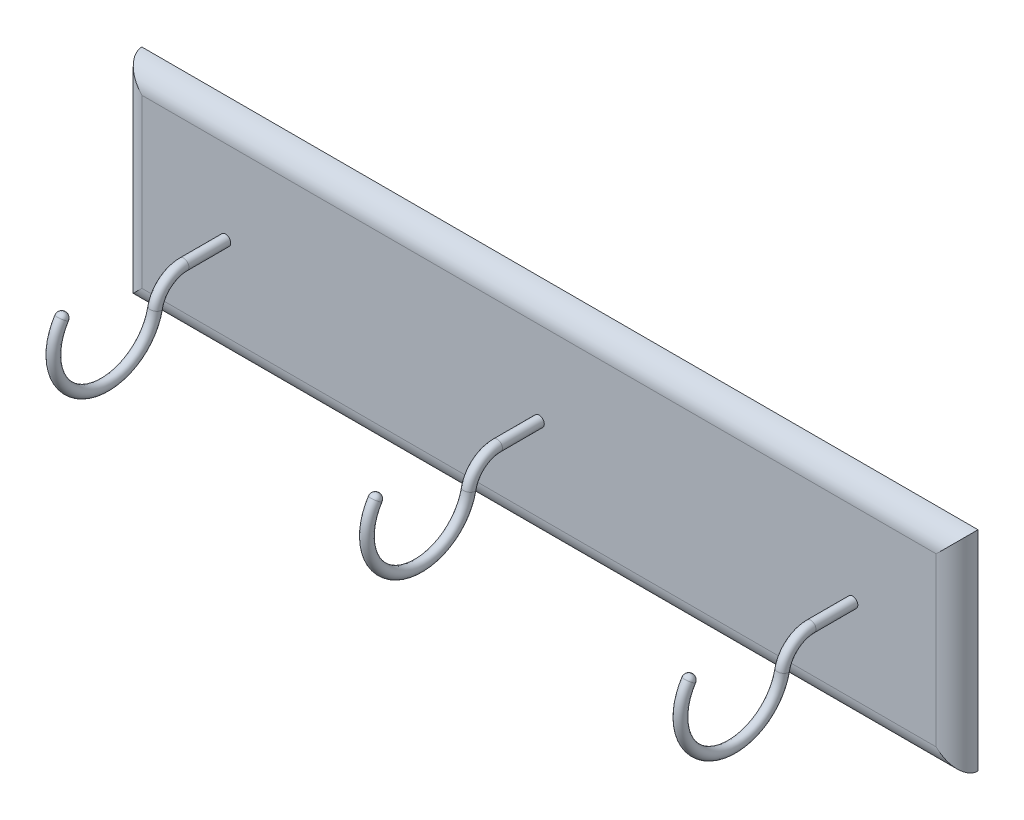
ISO-10303-21;
HEADER;
FILE_DESCRIPTION(('STEP AP214'),'2;1');
FILE_NAME('part.step','',(''),(''),'','','');
FILE_SCHEMA(('AUTOMOTIVE_DESIGN { 1 0 10303 214 1 1 1 1 }'));
ENDSEC;
DATA;
#1=APPLICATION_CONTEXT('core data for automotive mechanical design processes');
#2=APPLICATION_PROTOCOL_DEFINITION('international standard','automotive_design',2000,#1);
#3=PRODUCT_CONTEXT('',#1,'mechanical');
#4=PRODUCT('Part','Part','',(#3));
#5=PRODUCT_RELATED_PRODUCT_CATEGORY('part','',(#4));
#6=PRODUCT_DEFINITION_FORMATION('','',#4);
#7=PRODUCT_DEFINITION_CONTEXT('part definition',#1,'design');
#8=PRODUCT_DEFINITION('design','',#6,#7);
#9=PRODUCT_DEFINITION_SHAPE('','',#8);
#10=(LENGTH_UNIT() NAMED_UNIT(*) SI_UNIT(.MILLI.,.METRE.));
#11=(NAMED_UNIT(*) PLANE_ANGLE_UNIT() SI_UNIT($,.RADIAN.));
#12=(NAMED_UNIT(*) SI_UNIT($,.STERADIAN.) SOLID_ANGLE_UNIT());
#13=UNCERTAINTY_MEASURE_WITH_UNIT(LENGTH_MEASURE(1.E-05),#10,'distance_accuracy_value','');
#14=(GEOMETRIC_REPRESENTATION_CONTEXT(3) GLOBAL_UNCERTAINTY_ASSIGNED_CONTEXT((#13)) GLOBAL_UNIT_ASSIGNED_CONTEXT((#10,
#11,#12)) REPRESENTATION_CONTEXT('',''));
#15=CARTESIAN_POINT('',(0.,0.,0.));
#16=DIRECTION('',(0.,0.,1.));
#17=DIRECTION('',(1.,0.,0.));
#18=AXIS2_PLACEMENT_3D('',#15,#16,#17);
#19=CARTESIAN_POINT('',(0.,0.,10.));
#20=DIRECTION('',(0.,0.,-1.));
#21=DIRECTION('',(-1.,0.,0.));
#22=AXIS2_PLACEMENT_3D('',#19,#20,#21);
#23=PLANE('',#22);
#24=CARTESIAN_POINT('',(150.,0.,10.));
#25=DIRECTION('',(0.,0.,-1.));
#26=DIRECTION('',(-1.,0.,0.));
#27=AXIS2_PLACEMENT_3D('',#24,#25,#26);
#28=CIRCLE('',#27,2.5);
#29=CARTESIAN_POINT('',(147.5,0.,10.));
#30=VERTEX_POINT('',#29);
#31=EDGE_CURVE('E42',#30,#30,#28,.F.);
#32=ORIENTED_EDGE('',*,*,#31,.F.);
#33=EDGE_LOOP('',(#32));
#34=FACE_BOUND('',#33,.T.);
#35=DIRECTION('',(0.,-1.,0.));
#36=VECTOR('',#35,1.);
#37=CARTESIAN_POINT('',(-190.,0.,10.));
#38=LINE('',#37,#36);
#39=CARTESIAN_POINT('',(-190.,40.,10.));
#40=VERTEX_POINT('',#39);
#41=CARTESIAN_POINT('',(-190.,-40.,10.));
#42=VERTEX_POINT('',#41);
#43=EDGE_CURVE('E49',#40,#42,#38,.T.);
#44=ORIENTED_EDGE('',*,*,#43,.T.);
#45=DIRECTION('',(1.,0.,0.));
#46=VECTOR('',#45,1.);
#47=CARTESIAN_POINT('',(0.,-40.,10.));
#48=LINE('',#47,#46);
#49=CARTESIAN_POINT('',(190.,-40.,10.));
#50=VERTEX_POINT('',#49);
#51=EDGE_CURVE('E110',#42,#50,#48,.T.);
#52=ORIENTED_EDGE('',*,*,#51,.T.);
#53=DIRECTION('',(0.,1.,0.));
#54=VECTOR('',#53,1.);
#55=CARTESIAN_POINT('',(190.,0.,10.));
#56=LINE('',#55,#54);
#57=CARTESIAN_POINT('',(190.,40.,10.));
#58=VERTEX_POINT('',#57);
#59=EDGE_CURVE('E106',#50,#58,#56,.T.);
#60=ORIENTED_EDGE('',*,*,#59,.T.);
#61=DIRECTION('',(-1.,0.,0.));
#62=VECTOR('',#61,1.);
#63=CARTESIAN_POINT('',(0.,40.,10.));
#64=LINE('',#63,#62);
#65=EDGE_CURVE('E54',#58,#40,#64,.T.);
#66=ORIENTED_EDGE('',*,*,#65,.T.);
#67=EDGE_LOOP('',(#44,#52,#60,#66));
#68=FACE_BOUND('',#67,.T.);
#69=CARTESIAN_POINT('',(0.,0.,10.));
#70=DIRECTION('',(0.,0.,1.));
#71=DIRECTION('',(1.,0.,0.));
#72=AXIS2_PLACEMENT_3D('',#69,#70,#71);
#73=CIRCLE('',#72,2.5);
#74=CARTESIAN_POINT('',(2.5,0.,10.));
#75=VERTEX_POINT('',#74);
#76=EDGE_CURVE('E112',#75,#75,#73,.T.);
#77=ORIENTED_EDGE('',*,*,#76,.F.);
#78=EDGE_LOOP('',(#77));
#79=FACE_BOUND('',#78,.T.);
#80=CARTESIAN_POINT('',(-150.,0.,10.));
#81=DIRECTION('',(0.,0.,-1.));
#82=DIRECTION('',(-1.,0.,0.));
#83=AXIS2_PLACEMENT_3D('',#80,#81,#82);
#84=CIRCLE('',#83,2.5);
#85=CARTESIAN_POINT('',(-152.5,0.,10.));
#86=VERTEX_POINT('',#85);
#87=EDGE_CURVE('E11',#86,#86,#84,.F.);
#88=ORIENTED_EDGE('',*,*,#87,.F.);
#89=EDGE_LOOP('',(#88));
#90=FACE_BOUND('',#89,.T.);
#91=ADVANCED_FACE('F33',(#34,#68,#79,#90),#23,.F.);
#92=CARTESIAN_POINT('',(0.,0.,0.));
#93=DIRECTION('',(0.,0.,-1.));
#94=DIRECTION('',(-1.,0.,0.));
#95=AXIS2_PLACEMENT_3D('',#92,#93,#94);
#96=PLANE('',#95);
#97=DIRECTION('',(0.,1.,0.));
#98=VECTOR('',#97,1.);
#99=CARTESIAN_POINT('',(200.,-50.,0.));
#100=LINE('',#99,#98);
#101=CARTESIAN_POINT('',(200.,-50.,0.));
#102=VERTEX_POINT('',#101);
#103=CARTESIAN_POINT('',(200.,50.,0.));
#104=VERTEX_POINT('',#103);
#105=EDGE_CURVE('E79',#102,#104,#100,.T.);
#106=ORIENTED_EDGE('',*,*,#105,.F.);
#107=DIRECTION('',(1.,0.,0.));
#108=VECTOR('',#107,1.);
#109=CARTESIAN_POINT('',(-200.,-50.,0.));
#110=LINE('',#109,#108);
#111=CARTESIAN_POINT('',(-200.,-50.,0.));
#112=VERTEX_POINT('',#111);
#113=EDGE_CURVE('E104',#112,#102,#110,.T.);
#114=ORIENTED_EDGE('',*,*,#113,.F.);
#115=DIRECTION('',(0.,-1.,0.));
#116=VECTOR('',#115,1.);
#117=CARTESIAN_POINT('',(-200.,-50.,0.));
#118=LINE('',#117,#116);
#119=CARTESIAN_POINT('',(-200.,50.,0.));
#120=VERTEX_POINT('',#119);
#121=EDGE_CURVE('E82',#120,#112,#118,.T.);
#122=ORIENTED_EDGE('',*,*,#121,.F.);
#123=DIRECTION('',(-1.,0.,0.));
#124=VECTOR('',#123,1.);
#125=CARTESIAN_POINT('',(-200.,50.,0.));
#126=LINE('',#125,#124);
#127=EDGE_CURVE('E74',#104,#120,#126,.T.);
#128=ORIENTED_EDGE('',*,*,#127,.F.);
#129=EDGE_LOOP('',(#106,#114,#122,#128));
#130=FACE_BOUND('',#129,.T.);
#131=ADVANCED_FACE('F76',(#130),#96,.T.);
#132=CARTESIAN_POINT('',(0.,40.,0.));
#133=DIRECTION('',(-1.,0.,0.));
#134=DIRECTION('',(0.,0.,1.));
#135=AXIS2_PLACEMENT_3D('',#132,#133,#134);
#136=CYLINDRICAL_SURFACE('',#135,10.);
#137=CARTESIAN_POINT('',(190.,40.,0.));
#138=DIRECTION('',(-0.707106781186547,0.707106781186547,0.));
#139=DIRECTION('',(0.707106781186547,0.707106781186547,0.));
#140=AXIS2_PLACEMENT_3D('',#137,#138,#139);
#141=ELLIPSE('',#140,14.1421356237309,10.);
#142=EDGE_CURVE('E87',#104,#58,#141,.F.);
#143=ORIENTED_EDGE('',*,*,#142,.F.);
#144=ORIENTED_EDGE('',*,*,#127,.T.);
#145=CARTESIAN_POINT('',(-190.,40.,0.));
#146=DIRECTION('',(-0.707106781186547,-0.707106781186547,0.));
#147=DIRECTION('',(-0.707106781186547,0.707106781186547,0.));
#148=AXIS2_PLACEMENT_3D('',#145,#146,#147);
#149=ELLIPSE('',#148,14.1421356237309,10.);
#150=EDGE_CURVE('E91',#40,#120,#149,.T.);
#151=ORIENTED_EDGE('',*,*,#150,.F.);
#152=ORIENTED_EDGE('',*,*,#65,.F.);
#153=EDGE_LOOP('',(#143,#144,#151,#152));
#154=FACE_BOUND('',#153,.T.);
#155=ADVANCED_FACE('F88',(#154),#136,.T.);
#156=CARTESIAN_POINT('',(-190.,0.,0.));
#157=DIRECTION('',(0.,-1.,0.));
#158=DIRECTION('',(0.,0.,-1.));
#159=AXIS2_PLACEMENT_3D('',#156,#157,#158);
#160=CYLINDRICAL_SURFACE('',#159,10.);
#161=ORIENTED_EDGE('',*,*,#150,.T.);
#162=ORIENTED_EDGE('',*,*,#121,.T.);
#163=CARTESIAN_POINT('',(-190.,-40.,0.));
#164=DIRECTION('',(0.707106781186547,-0.707106781186547,0.));
#165=DIRECTION('',(-0.707106781186547,-0.707106781186547,0.));
#166=AXIS2_PLACEMENT_3D('',#163,#164,#165);
#167=ELLIPSE('',#166,14.1421356237309,10.);
#168=EDGE_CURVE('E92',#42,#112,#167,.T.);
#169=ORIENTED_EDGE('',*,*,#168,.F.);
#170=ORIENTED_EDGE('',*,*,#43,.F.);
#171=EDGE_LOOP('',(#161,#162,#169,#170));
#172=FACE_BOUND('',#171,.T.);
#173=ADVANCED_FACE('F197',(#172),#160,.T.);
#174=CARTESIAN_POINT('',(190.,0.,0.));
#175=DIRECTION('',(0.,1.,0.));
#176=DIRECTION('',(0.,0.,1.));
#177=AXIS2_PLACEMENT_3D('',#174,#175,#176);
#178=CYLINDRICAL_SURFACE('',#177,10.);
#179=ORIENTED_EDGE('',*,*,#142,.T.);
#180=ORIENTED_EDGE('',*,*,#59,.F.);
#181=CARTESIAN_POINT('',(190.,-40.,0.));
#182=DIRECTION('',(0.707106781186547,0.707106781186547,0.));
#183=DIRECTION('',(-0.707106781186547,0.707106781186547,0.));
#184=AXIS2_PLACEMENT_3D('',#181,#182,#183);
#185=ELLIPSE('',#184,14.1421356237309,10.);
#186=EDGE_CURVE('E96',#102,#50,#185,.F.);
#187=ORIENTED_EDGE('',*,*,#186,.F.);
#188=ORIENTED_EDGE('',*,*,#105,.T.);
#189=EDGE_LOOP('',(#179,#180,#187,#188));
#190=FACE_BOUND('',#189,.T.);
#191=ADVANCED_FACE('F95',(#190),#178,.T.);
#192=CARTESIAN_POINT('',(0.,-40.,0.));
#193=DIRECTION('',(1.,0.,0.));
#194=DIRECTION('',(0.,0.,-1.));
#195=AXIS2_PLACEMENT_3D('',#192,#193,#194);
#196=CYLINDRICAL_SURFACE('',#195,10.);
#197=ORIENTED_EDGE('',*,*,#168,.T.);
#198=ORIENTED_EDGE('',*,*,#113,.T.);
#199=ORIENTED_EDGE('',*,*,#186,.T.);
#200=ORIENTED_EDGE('',*,*,#51,.F.);
#201=EDGE_LOOP('',(#197,#198,#199,#200));
#202=FACE_BOUND('',#201,.T.);
#203=ADVANCED_FACE('F187',(#202),#196,.T.);
#204=CARTESIAN_POINT('',(0.,-6.46562704163875,67.7783170787396));
#205=DIRECTION('',(-1.,0.,0.));
#206=DIRECTION('',(0.,0.,1.));
#207=AXIS2_PLACEMENT_3D('',#204,#205,#206);
#208=TOROIDAL_SURFACE('',#207,24.5773446042007,2.5);
#209=CARTESIAN_POINT('',(0.,-11.2306188257926,43.6673087818936));
#210=DIRECTION('',(0.,-0.981025765196988,0.193877404613493));
#211=DIRECTION('',(1.,0.,0.));
#212=AXIS2_PLACEMENT_3D('',#209,#210,#211);
#213=CIRCLE('',#212,2.5);
#214=CARTESIAN_POINT('',(0.,-11.7153123373263,41.2147443689012));
#215=VERTEX_POINT('',#214);
#216=EDGE_CURVE('E100',#215,#215,#213,.T.);
#217=CARTESIAN_POINT('',(0.,6.9491805979503,88.3717335943753));
#218=DIRECTION('',(0.,0.837902419780365,-0.545820057277312));
#219=DIRECTION('',(1.,0.,0.));
#220=AXIS2_PLACEMENT_3D('',#217,#218,#219);
#221=CIRCLE('',#220,2.5);
#222=CARTESIAN_POINT('',(0.,8.31373074114357,90.4664896438262));
#223=VERTEX_POINT('',#222);
#224=EDGE_CURVE('E114',#223,#223,#221,.T.);
#225=CARTESIAN_POINT('',(0.,-6.46562704163875,67.7783170787396));
#226=DIRECTION('',(-1.,0.,0.));
#227=DIRECTION('',(0.,0.,1.));
#228=AXIS2_PLACEMENT_3D('',#225,#226,#227);
#229=CIRCLE('',#228,27.0773446042007);
#230=EDGE_CURVE('',#215,#223,#229,.T.);
#231=ORIENTED_EDGE('',*,*,#216,.T.);
#232=ORIENTED_EDGE('',*,*,#224,.F.);
#233=ORIENTED_EDGE('',*,*,#230,.T.);
#234=ORIENTED_EDGE('',*,*,#230,.F.);
#235=EDGE_LOOP('',(#231,#233,#232,#234));
#236=FACE_BOUND('',#235,.T.);
#237=ADVANCED_FACE('F184',(#236),#208,.T.);
#238=CARTESIAN_POINT('',(0.,-13.9316512030133,30.));
#239=DIRECTION('',(1.,0.,0.));
#240=DIRECTION('',(0.,0.,-1.));
#241=AXIS2_PLACEMENT_3D('',#238,#239,#240);
#242=TOROIDAL_SURFACE('',#241,13.9316512030133,2.5);
#243=CARTESIAN_POINT('',(0.,0.,30.));
#244=DIRECTION('',(0.,0.,1.));
#245=DIRECTION('',(1.,0.,0.));
#246=AXIS2_PLACEMENT_3D('',#243,#244,#245);
#247=CIRCLE('',#246,2.5);
#248=CARTESIAN_POINT('',(2.5,0.,30.));
#249=VERTEX_POINT('',#248);
#250=EDGE_CURVE('E122',#249,#249,#247,.T.);
#251=ORIENTED_EDGE('',*,*,#250,.T.);
#252=EDGE_LOOP('',(#251));
#253=FACE_BOUND('',#252,.T.);
#254=ORIENTED_EDGE('',*,*,#216,.F.);
#255=EDGE_LOOP('',(#254));
#256=FACE_BOUND('',#255,.T.);
#257=ADVANCED_FACE('F180',(#253,#256),#242,.T.);
#258=CARTESIAN_POINT('',(0.,0.,30.));
#259=DIRECTION('',(0.,0.,-1.));
#260=DIRECTION('',(0.,1.,0.));
#261=AXIS2_PLACEMENT_3D('',#258,#259,#260);
#262=CYLINDRICAL_SURFACE('',#261,2.5);
#263=ORIENTED_EDGE('',*,*,#250,.F.);
#264=EDGE_LOOP('',(#263));
#265=FACE_BOUND('',#264,.T.);
#266=ORIENTED_EDGE('',*,*,#76,.T.);
#267=EDGE_LOOP('',(#266));
#268=FACE_BOUND('',#267,.T.);
#269=ADVANCED_FACE('F139',(#265,#268),#262,.T.);
#270=CARTESIAN_POINT('',(0.,6.9491805979503,88.3717335943753));
#271=DIRECTION('',(0.,0.,1.));
#272=DIRECTION('',(1.,0.,0.));
#273=AXIS2_PLACEMENT_3D('',#270,#271,#272);
#274=SPHERICAL_SURFACE('',#273,2.5);
#275=CARTESIAN_POINT('',(0.,6.9491805979503,88.3717335943753));
#276=DIRECTION('',(0.,0.837902419780365,-0.545820057277312));
#277=DIRECTION('',(1.,0.,0.));
#278=AXIS2_PLACEMENT_3D('',#275,#276,#277);
#279=SPHERICAL_SURFACE('',#278,2.5);
#280=ORIENTED_EDGE('',*,*,#224,.T.);
#281=EDGE_LOOP('',(#280));
#282=FACE_BOUND('',#281,.T.);
#283=ADVANCED_FACE('F177',(#282),#279,.T.);
#284=CARTESIAN_POINT('',(150.,-6.46562704163875,67.7783170787396));
#285=DIRECTION('',(-1.,0.,0.));
#286=DIRECTION('',(0.,0.,1.));
#287=AXIS2_PLACEMENT_3D('',#284,#285,#286);
#288=TOROIDAL_SURFACE('',#287,24.5773446042007,2.5);
#289=CARTESIAN_POINT('',(150.,-11.2306188257926,43.6673087818936));
#290=DIRECTION('',(0.,-0.981025765196988,0.193877404613493));
#291=DIRECTION('',(1.,0.,0.));
#292=AXIS2_PLACEMENT_3D('',#289,#290,#291);
#293=CIRCLE('',#292,2.5);
#294=CARTESIAN_POINT('',(150.,-11.7153123373263,41.2147443689012));
#295=VERTEX_POINT('',#294);
#296=EDGE_CURVE('E123',#295,#295,#293,.T.);
#297=CARTESIAN_POINT('',(150.,6.9491805979503,88.3717335943753));
#298=DIRECTION('',(0.,0.837902419780365,-0.545820057277312));
#299=DIRECTION('',(1.,0.,0.));
#300=AXIS2_PLACEMENT_3D('',#297,#298,#299);
#301=CIRCLE('',#300,2.5);
#302=CARTESIAN_POINT('',(150.,8.31373074114357,90.4664896438262));
#303=VERTEX_POINT('',#302);
#304=EDGE_CURVE('E120',#303,#303,#301,.T.);
#305=CARTESIAN_POINT('',(150.,-6.46562704163875,67.7783170787396));
#306=DIRECTION('',(-1.,0.,0.));
#307=DIRECTION('',(0.,0.,1.));
#308=AXIS2_PLACEMENT_3D('',#305,#306,#307);
#309=CIRCLE('',#308,27.0773446042007);
#310=EDGE_CURVE('',#295,#303,#309,.T.);
#311=ORIENTED_EDGE('',*,*,#296,.T.);
#312=ORIENTED_EDGE('',*,*,#304,.F.);
#313=ORIENTED_EDGE('',*,*,#310,.T.);
#314=ORIENTED_EDGE('',*,*,#310,.F.);
#315=EDGE_LOOP('',(#311,#313,#312,#314));
#316=FACE_BOUND('',#315,.T.);
#317=ADVANCED_FACE('F173',(#316),#288,.T.);
#318=CARTESIAN_POINT('',(150.,-13.9316512030133,30.));
#319=DIRECTION('',(1.,0.,0.));
#320=DIRECTION('',(0.,0.,-1.));
#321=AXIS2_PLACEMENT_3D('',#318,#319,#320);
#322=TOROIDAL_SURFACE('',#321,13.9316512030133,2.5);
#323=CARTESIAN_POINT('',(150.,0.,30.));
#324=DIRECTION('',(0.,0.,1.));
#325=DIRECTION('',(1.,0.,0.));
#326=AXIS2_PLACEMENT_3D('',#323,#324,#325);
#327=CIRCLE('',#326,2.5);
#328=CARTESIAN_POINT('',(152.5,0.,30.));
#329=VERTEX_POINT('',#328);
#330=EDGE_CURVE('E129',#329,#329,#327,.T.);
#331=ORIENTED_EDGE('',*,*,#330,.T.);
#332=EDGE_LOOP('',(#331));
#333=FACE_BOUND('',#332,.T.);
#334=ORIENTED_EDGE('',*,*,#296,.F.);
#335=EDGE_LOOP('',(#334));
#336=FACE_BOUND('',#335,.T.);
#337=ADVANCED_FACE('F169',(#333,#336),#322,.T.);
#338=CARTESIAN_POINT('',(150.,0.,30.));
#339=DIRECTION('',(0.,0.,-1.));
#340=DIRECTION('',(0.,1.,0.));
#341=AXIS2_PLACEMENT_3D('',#338,#339,#340);
#342=CYLINDRICAL_SURFACE('',#341,2.5);
#343=ORIENTED_EDGE('',*,*,#330,.F.);
#344=EDGE_LOOP('',(#343));
#345=FACE_BOUND('',#344,.T.);
#346=ORIENTED_EDGE('',*,*,#31,.T.);
#347=EDGE_LOOP('',(#346));
#348=FACE_BOUND('',#347,.T.);
#349=ADVANCED_FACE('F166',(#345,#348),#342,.T.);
#350=CARTESIAN_POINT('',(150.,6.9491805979503,88.3717335943753));
#351=DIRECTION('',(0.,0.,1.));
#352=DIRECTION('',(1.,0.,0.));
#353=AXIS2_PLACEMENT_3D('',#350,#351,#352);
#354=SPHERICAL_SURFACE('',#353,2.5);
#355=CARTESIAN_POINT('',(150.,6.9491805979503,88.3717335943753));
#356=DIRECTION('',(0.,0.837902419780365,-0.545820057277312));
#357=DIRECTION('',(1.,0.,0.));
#358=AXIS2_PLACEMENT_3D('',#355,#356,#357);
#359=SPHERICAL_SURFACE('',#358,2.5);
#360=ORIENTED_EDGE('',*,*,#304,.T.);
#361=EDGE_LOOP('',(#360));
#362=FACE_BOUND('',#361,.T.);
#363=ADVANCED_FACE('F164',(#362),#359,.T.);
#364=CARTESIAN_POINT('',(-150.,-6.46562704163875,67.7783170787396));
#365=DIRECTION('',(-1.,0.,0.));
#366=DIRECTION('',(0.,0.,1.));
#367=AXIS2_PLACEMENT_3D('',#364,#365,#366);
#368=TOROIDAL_SURFACE('',#367,24.5773446042007,2.5);
#369=CARTESIAN_POINT('',(-150.,-11.2306188257926,43.6673087818936));
#370=DIRECTION('',(0.,-0.981025765196988,0.193877404613493));
#371=DIRECTION('',(1.,0.,0.));
#372=AXIS2_PLACEMENT_3D('',#369,#370,#371);
#373=CIRCLE('',#372,2.5);
#374=CARTESIAN_POINT('',(-150.,-11.7153123373263,41.2147443689012));
#375=VERTEX_POINT('',#374);
#376=EDGE_CURVE('E327',#375,#375,#373,.T.);
#377=CARTESIAN_POINT('',(-150.,6.9491805979503,88.3717335943753));
#378=DIRECTION('',(0.,0.837902419780365,-0.545820057277312));
#379=DIRECTION('',(1.,0.,0.));
#380=AXIS2_PLACEMENT_3D('',#377,#378,#379);
#381=CIRCLE('',#380,2.5);
#382=CARTESIAN_POINT('',(-150.,8.31373074114357,90.4664896438262));
#383=VERTEX_POINT('',#382);
#384=EDGE_CURVE('E37',#383,#383,#381,.T.);
#385=CARTESIAN_POINT('',(-150.,-6.46562704163875,67.7783170787396));
#386=DIRECTION('',(-1.,0.,0.));
#387=DIRECTION('',(0.,0.,1.));
#388=AXIS2_PLACEMENT_3D('',#385,#386,#387);
#389=CIRCLE('',#388,27.0773446042007);
#390=EDGE_CURVE('',#375,#383,#389,.T.);
#391=ORIENTED_EDGE('',*,*,#376,.T.);
#392=ORIENTED_EDGE('',*,*,#384,.F.);
#393=ORIENTED_EDGE('',*,*,#390,.T.);
#394=ORIENTED_EDGE('',*,*,#390,.F.);
#395=EDGE_LOOP('',(#391,#393,#392,#394));
#396=FACE_BOUND('',#395,.T.);
#397=ADVANCED_FACE('F157',(#396),#368,.T.);
#398=CARTESIAN_POINT('',(-150.,-13.9316512030133,30.));
#399=DIRECTION('',(1.,0.,0.));
#400=DIRECTION('',(0.,0.,-1.));
#401=AXIS2_PLACEMENT_3D('',#398,#399,#400);
#402=TOROIDAL_SURFACE('',#401,13.9316512030133,2.5);
#403=CARTESIAN_POINT('',(-150.,0.,30.));
#404=DIRECTION('',(0.,0.,1.));
#405=DIRECTION('',(1.,0.,0.));
#406=AXIS2_PLACEMENT_3D('',#403,#404,#405);
#407=CIRCLE('',#406,2.5);
#408=CARTESIAN_POINT('',(-147.5,0.,30.));
#409=VERTEX_POINT('',#408);
#410=EDGE_CURVE('E330',#409,#409,#407,.T.);
#411=ORIENTED_EDGE('',*,*,#410,.T.);
#412=EDGE_LOOP('',(#411));
#413=FACE_BOUND('',#412,.T.);
#414=ORIENTED_EDGE('',*,*,#376,.F.);
#415=EDGE_LOOP('',(#414));
#416=FACE_BOUND('',#415,.T.);
#417=ADVANCED_FACE('F149',(#413,#416),#402,.T.);
#418=CARTESIAN_POINT('',(-150.,0.,30.));
#419=DIRECTION('',(0.,0.,-1.));
#420=DIRECTION('',(0.,1.,0.));
#421=AXIS2_PLACEMENT_3D('',#418,#419,#420);
#422=CYLINDRICAL_SURFACE('',#421,2.5);
#423=ORIENTED_EDGE('',*,*,#410,.F.);
#424=EDGE_LOOP('',(#423));
#425=FACE_BOUND('',#424,.T.);
#426=ORIENTED_EDGE('',*,*,#87,.T.);
#427=EDGE_LOOP('',(#426));
#428=FACE_BOUND('',#427,.T.);
#429=ADVANCED_FACE('F147',(#425,#428),#422,.T.);
#430=CARTESIAN_POINT('',(-150.,6.9491805979503,88.3717335943753));
#431=DIRECTION('',(0.,0.,1.));
#432=DIRECTION('',(1.,0.,0.));
#433=AXIS2_PLACEMENT_3D('',#430,#431,#432);
#434=SPHERICAL_SURFACE('',#433,2.5);
#435=CARTESIAN_POINT('',(-150.,6.9491805979503,88.3717335943753));
#436=DIRECTION('',(0.,0.837902419780365,-0.545820057277312));
#437=DIRECTION('',(1.,0.,0.));
#438=AXIS2_PLACEMENT_3D('',#435,#436,#437);
#439=SPHERICAL_SURFACE('',#438,2.5);
#440=ORIENTED_EDGE('',*,*,#384,.T.);
#441=EDGE_LOOP('',(#440));
#442=FACE_BOUND('',#441,.T.);
#443=ADVANCED_FACE('F35',(#442),#439,.T.);
#444=CLOSED_SHELL('',(#91,#131,#155,#173,#191,#203,#237,#257,#269,#283,#317,#337,#349,#363,#397,
#417,#429,#443));
#445=MANIFOLD_SOLID_BREP('B2',#444);
#446=ADVANCED_BREP_SHAPE_REPRESENTATION('',(#18,#445),#14);
#447=SHAPE_DEFINITION_REPRESENTATION(#9,#446);
ENDSEC;
END-ISO-10303-21;
